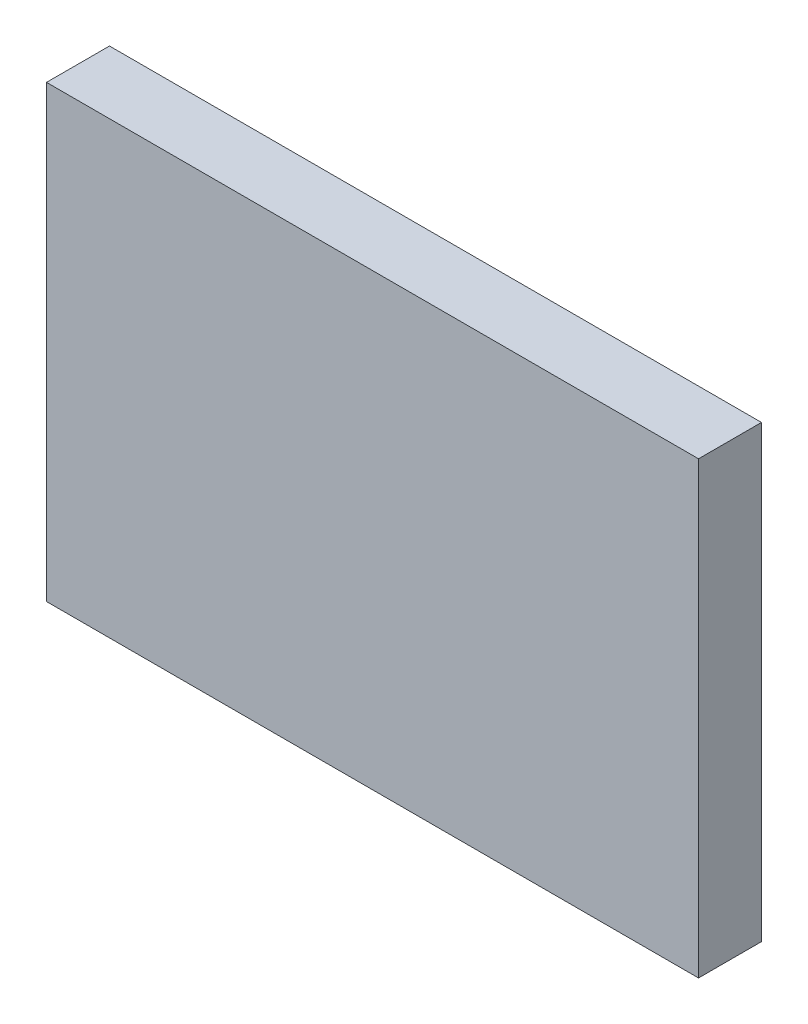
ISO-10303-21;
HEADER;
FILE_DESCRIPTION(('STEP AP214'),'2;1');
FILE_NAME('part.step','',(''),(''),'','','');
FILE_SCHEMA(('AUTOMOTIVE_DESIGN { 1 0 10303 214 1 1 1 1 }'));
ENDSEC;
DATA;
#1=APPLICATION_CONTEXT('core data for automotive mechanical design processes');
#2=APPLICATION_PROTOCOL_DEFINITION('international standard','automotive_design',2000,#1);
#3=PRODUCT_CONTEXT('',#1,'mechanical');
#4=PRODUCT('Part','Part','',(#3));
#5=PRODUCT_RELATED_PRODUCT_CATEGORY('part','',(#4));
#6=PRODUCT_DEFINITION_FORMATION('','',#4);
#7=PRODUCT_DEFINITION_CONTEXT('part definition',#1,'design');
#8=PRODUCT_DEFINITION('design','',#6,#7);
#9=PRODUCT_DEFINITION_SHAPE('','',#8);
#10=(LENGTH_UNIT() NAMED_UNIT(*) SI_UNIT(.MILLI.,.METRE.));
#11=(NAMED_UNIT(*) PLANE_ANGLE_UNIT() SI_UNIT($,.RADIAN.));
#12=(NAMED_UNIT(*) SI_UNIT($,.STERADIAN.) SOLID_ANGLE_UNIT());
#13=UNCERTAINTY_MEASURE_WITH_UNIT(LENGTH_MEASURE(1.E-05),#10,'distance_accuracy_value','');
#14=(GEOMETRIC_REPRESENTATION_CONTEXT(3) GLOBAL_UNCERTAINTY_ASSIGNED_CONTEXT((#13)) GLOBAL_UNIT_ASSIGNED_CONTEXT((#10,
#11,#12)) REPRESENTATION_CONTEXT('',''));
#15=CARTESIAN_POINT('',(0.,0.,0.));
#16=DIRECTION('',(0.,0.,1.));
#17=DIRECTION('',(1.,0.,0.));
#18=AXIS2_PLACEMENT_3D('',#15,#16,#17);
#19=CARTESIAN_POINT('',(0.,0.,1.4));
#20=DIRECTION('',(0.,0.,1.));
#21=DIRECTION('',(1.,0.,0.));
#22=AXIS2_PLACEMENT_3D('',#19,#20,#21);
#23=PLANE('',#22);
#24=DIRECTION('',(0.,1.,0.));
#25=VECTOR('',#24,1.);
#26=CARTESIAN_POINT('',(0.,0.,1.4));
#27=LINE('',#26,#25);
#28=CARTESIAN_POINT('',(0.,0.,1.4));
#29=VERTEX_POINT('',#28);
#30=CARTESIAN_POINT('',(0.,10.,1.4));
#31=VERTEX_POINT('',#30);
#32=EDGE_CURVE('E86',#29,#31,#27,.T.);
#33=ORIENTED_EDGE('',*,*,#32,.F.);
#34=DIRECTION('',(1.,0.,0.));
#35=VECTOR('',#34,1.);
#36=CARTESIAN_POINT('',(0.,0.,1.4));
#37=LINE('',#36,#35);
#38=CARTESIAN_POINT('',(14.5,0.,1.4));
#39=VERTEX_POINT('',#38);
#40=EDGE_CURVE('E75',#29,#39,#37,.T.);
#41=ORIENTED_EDGE('',*,*,#40,.T.);
#42=DIRECTION('',(0.,1.,0.));
#43=VECTOR('',#42,1.);
#44=CARTESIAN_POINT('',(14.5,0.,1.4));
#45=LINE('',#44,#43);
#46=CARTESIAN_POINT('',(14.5,10.,1.4));
#47=VERTEX_POINT('',#46);
#48=EDGE_CURVE('E83',#39,#47,#45,.T.);
#49=ORIENTED_EDGE('',*,*,#48,.T.);
#50=DIRECTION('',(1.,0.,0.));
#51=VECTOR('',#50,1.);
#52=CARTESIAN_POINT('',(0.,10.,1.4));
#53=LINE('',#52,#51);
#54=EDGE_CURVE('E11',#31,#47,#53,.T.);
#55=ORIENTED_EDGE('',*,*,#54,.F.);
#56=EDGE_LOOP('',(#33,#41,#49,#55));
#57=FACE_BOUND('',#56,.T.);
#58=ADVANCED_FACE('F17',(#57),#23,.T.);
#59=CARTESIAN_POINT('',(0.,0.,0.));
#60=DIRECTION('',(0.,0.,1.));
#61=DIRECTION('',(1.,0.,0.));
#62=AXIS2_PLACEMENT_3D('',#59,#60,#61);
#63=PLANE('',#62);
#64=DIRECTION('',(1.,0.,0.));
#65=VECTOR('',#64,1.);
#66=CARTESIAN_POINT('',(0.,10.,0.));
#67=LINE('',#66,#65);
#68=CARTESIAN_POINT('',(0.,10.,0.));
#69=VERTEX_POINT('',#68);
#70=CARTESIAN_POINT('',(14.5,10.,0.));
#71=VERTEX_POINT('',#70);
#72=EDGE_CURVE('E20',#69,#71,#67,.T.);
#73=ORIENTED_EDGE('',*,*,#72,.T.);
#74=DIRECTION('',(0.,1.,0.));
#75=VECTOR('',#74,1.);
#76=CARTESIAN_POINT('',(14.5,0.,0.));
#77=LINE('',#76,#75);
#78=CARTESIAN_POINT('',(14.5,0.,0.));
#79=VERTEX_POINT('',#78);
#80=EDGE_CURVE('E103',#79,#71,#77,.T.);
#81=ORIENTED_EDGE('',*,*,#80,.F.);
#82=DIRECTION('',(1.,0.,0.));
#83=VECTOR('',#82,1.);
#84=CARTESIAN_POINT('',(0.,0.,0.));
#85=LINE('',#84,#83);
#86=CARTESIAN_POINT('',(0.,0.,0.));
#87=VERTEX_POINT('',#86);
#88=EDGE_CURVE('E85',#87,#79,#85,.T.);
#89=ORIENTED_EDGE('',*,*,#88,.F.);
#90=DIRECTION('',(0.,1.,0.));
#91=VECTOR('',#90,1.);
#92=CARTESIAN_POINT('',(0.,0.,0.));
#93=LINE('',#92,#91);
#94=EDGE_CURVE('E90',#87,#69,#93,.T.);
#95=ORIENTED_EDGE('',*,*,#94,.T.);
#96=EDGE_LOOP('',(#73,#81,#89,#95));
#97=FACE_BOUND('',#96,.T.);
#98=ADVANCED_FACE('F118',(#97),#63,.F.);
#99=CARTESIAN_POINT('',(0.,10.,0.));
#100=DIRECTION('',(0.,1.,0.));
#101=DIRECTION('',(1.,0.,0.));
#102=AXIS2_PLACEMENT_3D('',#99,#100,#101);
#103=PLANE('',#102);
#104=ORIENTED_EDGE('',*,*,#72,.F.);
#105=DIRECTION('',(0.,0.,1.));
#106=VECTOR('',#105,1.);
#107=CARTESIAN_POINT('',(0.,10.,0.));
#108=LINE('',#107,#106);
#109=EDGE_CURVE('E91',#69,#31,#108,.T.);
#110=ORIENTED_EDGE('',*,*,#109,.T.);
#111=ORIENTED_EDGE('',*,*,#54,.T.);
#112=DIRECTION('',(0.,0.,1.));
#113=VECTOR('',#112,1.);
#114=CARTESIAN_POINT('',(14.5,10.,0.));
#115=LINE('',#114,#113);
#116=EDGE_CURVE('E106',#71,#47,#115,.T.);
#117=ORIENTED_EDGE('',*,*,#116,.F.);
#118=EDGE_LOOP('',(#104,#110,#111,#117));
#119=FACE_BOUND('',#118,.T.);
#120=ADVANCED_FACE('F117',(#119),#103,.T.);
#121=CARTESIAN_POINT('',(0.,0.,0.));
#122=DIRECTION('',(0.,1.,0.));
#123=DIRECTION('',(1.,0.,0.));
#124=AXIS2_PLACEMENT_3D('',#121,#122,#123);
#125=PLANE('',#124);
#126=DIRECTION('',(0.,0.,1.));
#127=VECTOR('',#126,1.);
#128=CARTESIAN_POINT('',(14.5,0.,0.));
#129=LINE('',#128,#127);
#130=EDGE_CURVE('E80',#79,#39,#129,.T.);
#131=ORIENTED_EDGE('',*,*,#130,.T.);
#132=ORIENTED_EDGE('',*,*,#40,.F.);
#133=DIRECTION('',(0.,0.,1.));
#134=VECTOR('',#133,1.);
#135=CARTESIAN_POINT('',(0.,0.,0.));
#136=LINE('',#135,#134);
#137=EDGE_CURVE('E72',#87,#29,#136,.T.);
#138=ORIENTED_EDGE('',*,*,#137,.F.);
#139=ORIENTED_EDGE('',*,*,#88,.T.);
#140=EDGE_LOOP('',(#131,#132,#138,#139));
#141=FACE_BOUND('',#140,.T.);
#142=ADVANCED_FACE('F73',(#141),#125,.F.);
#143=CARTESIAN_POINT('',(14.5,0.,0.));
#144=DIRECTION('',(1.,0.,0.));
#145=DIRECTION('',(0.,1.,0.));
#146=AXIS2_PLACEMENT_3D('',#143,#144,#145);
#147=PLANE('',#146);
#148=ORIENTED_EDGE('',*,*,#130,.F.);
#149=ORIENTED_EDGE('',*,*,#80,.T.);
#150=ORIENTED_EDGE('',*,*,#116,.T.);
#151=ORIENTED_EDGE('',*,*,#48,.F.);
#152=EDGE_LOOP('',(#148,#149,#150,#151));
#153=FACE_BOUND('',#152,.T.);
#154=ADVANCED_FACE('F116',(#153),#147,.T.);
#155=CARTESIAN_POINT('',(0.,0.,0.));
#156=DIRECTION('',(1.,0.,0.));
#157=DIRECTION('',(0.,1.,0.));
#158=AXIS2_PLACEMENT_3D('',#155,#156,#157);
#159=PLANE('',#158);
#160=ORIENTED_EDGE('',*,*,#32,.T.);
#161=ORIENTED_EDGE('',*,*,#109,.F.);
#162=ORIENTED_EDGE('',*,*,#94,.F.);
#163=ORIENTED_EDGE('',*,*,#137,.T.);
#164=EDGE_LOOP('',(#160,#161,#162,#163));
#165=FACE_BOUND('',#164,.T.);
#166=ADVANCED_FACE('F88',(#165),#159,.F.);
#167=CLOSED_SHELL('',(#58,#98,#120,#142,#154,#166));
#168=MANIFOLD_SOLID_BREP('B1',#167);
#169=ADVANCED_BREP_SHAPE_REPRESENTATION('',(#18,#168),#14);
#170=SHAPE_DEFINITION_REPRESENTATION(#9,#169);
ENDSEC;
END-ISO-10303-21;
